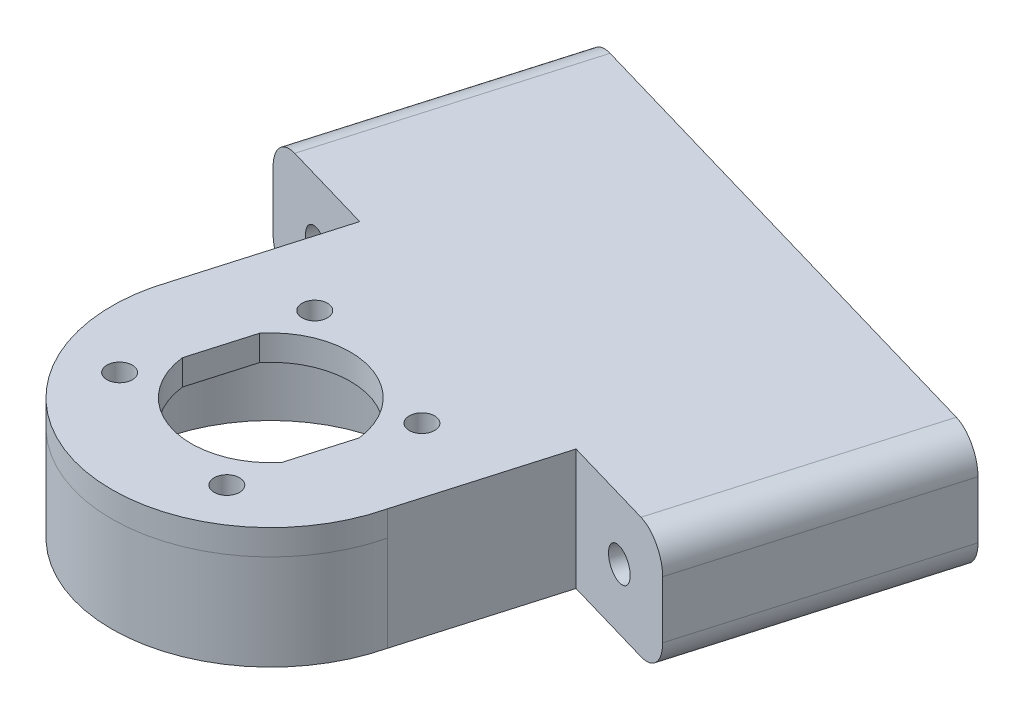
ISO-10303-21;
HEADER;
FILE_DESCRIPTION(('STEP AP214'),'2;1');
FILE_NAME('part.step','',(''),(''),'','','');
FILE_SCHEMA(('AUTOMOTIVE_DESIGN { 1 0 10303 214 1 1 1 1 }'));
ENDSEC;
DATA;
#1=APPLICATION_CONTEXT('core data for automotive mechanical design processes');
#2=APPLICATION_PROTOCOL_DEFINITION('international standard','automotive_design',2000,#1);
#3=PRODUCT_CONTEXT('',#1,'mechanical');
#4=PRODUCT('Part','Part','',(#3));
#5=PRODUCT_RELATED_PRODUCT_CATEGORY('part','',(#4));
#6=PRODUCT_DEFINITION_FORMATION('','',#4);
#7=PRODUCT_DEFINITION_CONTEXT('part definition',#1,'design');
#8=PRODUCT_DEFINITION('design','',#6,#7);
#9=PRODUCT_DEFINITION_SHAPE('','',#8);
#10=(LENGTH_UNIT() NAMED_UNIT(*) SI_UNIT(.MILLI.,.METRE.));
#11=(NAMED_UNIT(*) PLANE_ANGLE_UNIT() SI_UNIT($,.RADIAN.));
#12=(NAMED_UNIT(*) SI_UNIT($,.STERADIAN.) SOLID_ANGLE_UNIT());
#13=UNCERTAINTY_MEASURE_WITH_UNIT(LENGTH_MEASURE(1.E-05),#10,'distance_accuracy_value','');
#14=(GEOMETRIC_REPRESENTATION_CONTEXT(3) GLOBAL_UNCERTAINTY_ASSIGNED_CONTEXT((#13)) GLOBAL_UNIT_ASSIGNED_CONTEXT((#10,
#11,#12)) REPRESENTATION_CONTEXT('',''));
#15=CARTESIAN_POINT('',(0.,0.,0.));
#16=DIRECTION('',(0.,0.,1.));
#17=DIRECTION('',(1.,0.,0.));
#18=AXIS2_PLACEMENT_3D('',#15,#16,#17);
#19=CARTESIAN_POINT('',(0.,0.,0.));
#20=DIRECTION('',(0.,1.,0.));
#21=DIRECTION('',(0.,0.,1.));
#22=AXIS2_PLACEMENT_3D('',#19,#20,#21);
#23=PLANE('',#22);
#24=CARTESIAN_POINT('',(5.88266454172944,0.,48.519689923816));
#25=DIRECTION('',(0.,1.,0.));
#26=DIRECTION('',(0.,0.,1.));
#27=AXIS2_PLACEMENT_3D('',#24,#25,#26);
#28=CIRCLE('',#27,1.99999999999968);
#29=CARTESIAN_POINT('',(5.88266454172944,0.,50.5196899238156));
#30=VERTEX_POINT('',#29);
#31=EDGE_CURVE('E798',#30,#30,#28,.T.);
#32=ORIENTED_EDGE('',*,*,#31,.T.);
#33=EDGE_LOOP('',(#32));
#34=FACE_BOUND('',#33,.T.);
#35=CARTESIAN_POINT('',(12.7949477150797,0.,24.7558446682303));
#36=DIRECTION('',(0.,1.,0.));
#37=DIRECTION('',(0.,0.,1.));
#38=AXIS2_PLACEMENT_3D('',#35,#36,#37);
#39=CIRCLE('',#38,2.00000000000027);
#40=CARTESIAN_POINT('',(12.7949477150797,0.,26.7558446682306));
#41=VERTEX_POINT('',#40);
#42=EDGE_CURVE('E794',#41,#41,#39,.T.);
#43=ORIENTED_EDGE('',*,*,#42,.T.);
#44=EDGE_LOOP('',(#43));
#45=FACE_BOUND('',#44,.T.);
#46=CARTESIAN_POINT('',(36.5587929706653,0.,31.6681278415806));
#47=DIRECTION('',(0.,1.,0.));
#48=DIRECTION('',(0.,0.,1.));
#49=AXIS2_PLACEMENT_3D('',#46,#47,#48);
#50=CIRCLE('',#49,2.);
#51=CARTESIAN_POINT('',(36.5587929706653,0.,33.6681278415806));
#52=VERTEX_POINT('',#51);
#53=EDGE_CURVE('E791',#52,#52,#50,.T.);
#54=ORIENTED_EDGE('',*,*,#53,.T.);
#55=EDGE_LOOP('',(#54));
#56=FACE_BOUND('',#55,.T.);
#57=CARTESIAN_POINT('',(29.6465097973151,0.,55.4319730971662));
#58=DIRECTION('',(0.,1.,0.));
#59=DIRECTION('',(0.,0.,1.));
#60=AXIS2_PLACEMENT_3D('',#57,#58,#59);
#61=CIRCLE('',#60,1.99999999999937);
#62=CARTESIAN_POINT('',(29.6465097973151,0.,57.4319730971655));
#63=VERTEX_POINT('',#62);
#64=EDGE_CURVE('E784',#63,#63,#61,.T.);
#65=ORIENTED_EDGE('',*,*,#64,.T.);
#66=EDGE_LOOP('',(#65));
#67=FACE_BOUND('',#66,.T.);
#68=CARTESIAN_POINT('',(21.2207287561971,0.,40.0939088826978));
#69=DIRECTION('',(0.,1.,0.));
#70=DIRECTION('',(0.,0.,1.));
#71=AXIS2_PLACEMENT_3D('',#68,#69,#70);
#72=CIRCLE('',#71,12.5);
#73=CARTESIAN_POINT('',(8.81010151225684,0.,41.5859984952772));
#74=VERTEX_POINT('',#73);
#75=CARTESIAN_POINT('',(30.8948015652695,0.,48.009862096605));
#76=VERTEX_POINT('',#75);
#77=EDGE_CURVE('E296',#74,#76,#72,.T.);
#78=ORIENTED_EDGE('',*,*,#77,.T.);
#79=DIRECTION('',(0.279298417449034,0.,-0.960204350130984));
#80=VECTOR('',#79,1.);
#81=CARTESIAN_POINT('',(41.3602275698971,0.,12.0306121337904));
#82=LINE('',#81,#80);
#83=CARTESIAN_POINT('',(33.6313560001374,0.,38.6018192701185));
#84=VERTEX_POINT('',#83);
#85=EDGE_CURVE('E778',#76,#84,#82,.T.);
#86=ORIENTED_EDGE('',*,*,#85,.T.);
#87=CARTESIAN_POINT('',(21.2207287561971,0.,40.0939088826978));
#88=DIRECTION('',(0.,1.,0.));
#89=DIRECTION('',(0.,0.,1.));
#90=AXIS2_PLACEMENT_3D('',#87,#88,#89);
#91=CIRCLE('',#90,12.5);
#92=CARTESIAN_POINT('',(11.5466559471248,0.,32.1779556687906));
#93=VERTEX_POINT('',#92);
#94=EDGE_CURVE('E773',#84,#93,#91,.T.);
#95=ORIENTED_EDGE('',*,*,#94,.T.);
#96=DIRECTION('',(0.279298417449035,0.,-0.960204350130984));
#97=VECTOR('',#96,1.);
#98=CARTESIAN_POINT('',(19.2755275168845,0.,5.60674853246267));
#99=LINE('',#98,#97);
#100=EDGE_CURVE('E764',#74,#93,#99,.T.);
#101=ORIENTED_EDGE('',*,*,#100,.F.);
#102=EDGE_LOOP('',(#78,#86,#95,#101));
#103=FACE_BOUND('',#102,.T.);
#104=CARTESIAN_POINT('',(21.2207093880555,0.,40.093908619998));
#105=DIRECTION('',(0.,-1.,0.));
#106=DIRECTION('',(0.,0.,-1.));
#107=AXIS2_PLACEMENT_3D('',#104,#105,#106);
#108=CIRCLE('',#107,22.5);
#109=CARTESIAN_POINT('',(21.2207093880555,0.,17.593908619998));
#110=VERTEX_POINT('',#109);
#111=EDGE_CURVE('E290',#110,#110,#108,.T.);
#112=ORIENTED_EDGE('',*,*,#111,.T.);
#113=EDGE_LOOP('',(#112));
#114=FACE_BOUND('',#113,.T.);
#115=ADVANCED_FACE('F52',(#34,#45,#56,#67,#103,#114),#23,.F.);
#116=CARTESIAN_POINT('',(21.2207287561971,4.,40.0939088826978));
#117=DIRECTION('',(0.,-1.,0.));
#118=DIRECTION('',(0.,0.,-1.));
#119=AXIS2_PLACEMENT_3D('',#116,#117,#118);
#120=CYLINDRICAL_SURFACE('',#119,12.5);
#121=ORIENTED_EDGE('',*,*,#77,.F.);
#122=DIRECTION('',(0.,-1.,0.));
#123=VECTOR('',#122,1.);
#124=CARTESIAN_POINT('',(8.81010151225684,4.,41.5859984952772));
#125=LINE('',#124,#123);
#126=CARTESIAN_POINT('',(8.81010151225684,4.,41.5859984952772));
#127=VERTEX_POINT('',#126);
#128=EDGE_CURVE('E338',#127,#74,#125,.T.);
#129=ORIENTED_EDGE('',*,*,#128,.F.);
#130=CARTESIAN_POINT('',(21.2207287561971,4.,40.0939088826978));
#131=DIRECTION('',(0.,1.,0.));
#132=DIRECTION('',(0.,0.,1.));
#133=AXIS2_PLACEMENT_3D('',#130,#131,#132);
#134=CIRCLE('',#133,12.5);
#135=CARTESIAN_POINT('',(30.8948015652695,4.,48.009862096605));
#136=VERTEX_POINT('',#135);
#137=EDGE_CURVE('E301',#127,#136,#134,.T.);
#138=ORIENTED_EDGE('',*,*,#137,.T.);
#139=DIRECTION('',(0.,-1.,0.));
#140=VECTOR('',#139,1.);
#141=CARTESIAN_POINT('',(30.8948015652695,4.,48.009862096605));
#142=LINE('',#141,#140);
#143=EDGE_CURVE('E802',#136,#76,#142,.T.);
#144=ORIENTED_EDGE('',*,*,#143,.T.);
#145=EDGE_LOOP('',(#121,#129,#138,#144));
#146=FACE_BOUND('',#145,.T.);
#147=ADVANCED_FACE('F324',(#146),#120,.F.);
#148=CARTESIAN_POINT('',(19.2755275168845,4.,5.60674853246267));
#149=DIRECTION('',(-0.960204350130984,0.,-0.279298417449035));
#150=DIRECTION('',(-0.279298417449035,0.,0.960204350130984));
#151=AXIS2_PLACEMENT_3D('',#148,#149,#150);
#152=PLANE('',#151);
#153=ORIENTED_EDGE('',*,*,#100,.T.);
#154=DIRECTION('',(0.,-1.,0.));
#155=VECTOR('',#154,1.);
#156=CARTESIAN_POINT('',(11.5466559471248,4.,32.1779556687906));
#157=LINE('',#156,#155);
#158=CARTESIAN_POINT('',(11.5466559471248,4.,32.1779556687906));
#159=VERTEX_POINT('',#158);
#160=EDGE_CURVE('E767',#159,#93,#157,.T.);
#161=ORIENTED_EDGE('',*,*,#160,.F.);
#162=DIRECTION('',(0.279298417449035,0.,-0.960204350130984));
#163=VECTOR('',#162,1.);
#164=CARTESIAN_POINT('',(19.2755275168845,4.,5.60674853246267));
#165=LINE('',#164,#163);
#166=EDGE_CURVE('E812',#127,#159,#165,.T.);
#167=ORIENTED_EDGE('',*,*,#166,.F.);
#168=ORIENTED_EDGE('',*,*,#128,.T.);
#169=EDGE_LOOP('',(#153,#161,#167,#168));
#170=FACE_BOUND('',#169,.T.);
#171=ADVANCED_FACE('F519',(#170),#152,.F.);
#172=CARTESIAN_POINT('',(21.2207287561971,4.,40.0939088826978));
#173=DIRECTION('',(0.,-1.,0.));
#174=DIRECTION('',(0.,0.,-1.));
#175=AXIS2_PLACEMENT_3D('',#172,#173,#174);
#176=CYLINDRICAL_SURFACE('',#175,12.5);
#177=ORIENTED_EDGE('',*,*,#94,.F.);
#178=DIRECTION('',(0.,-1.,0.));
#179=VECTOR('',#178,1.);
#180=CARTESIAN_POINT('',(33.6313560001374,4.,38.6018192701185));
#181=LINE('',#180,#179);
#182=CARTESIAN_POINT('',(33.6313560001374,4.,38.6018192701185));
#183=VERTEX_POINT('',#182);
#184=EDGE_CURVE('E805',#183,#84,#181,.T.);
#185=ORIENTED_EDGE('',*,*,#184,.F.);
#186=CARTESIAN_POINT('',(21.2207287561971,4.,40.0939088826978));
#187=DIRECTION('',(0.,1.,0.));
#188=DIRECTION('',(0.,0.,1.));
#189=AXIS2_PLACEMENT_3D('',#186,#187,#188);
#190=CIRCLE('',#189,12.5);
#191=EDGE_CURVE('E833',#183,#159,#190,.T.);
#192=ORIENTED_EDGE('',*,*,#191,.T.);
#193=ORIENTED_EDGE('',*,*,#160,.T.);
#194=EDGE_LOOP('',(#177,#185,#192,#193));
#195=FACE_BOUND('',#194,.T.);
#196=ADVANCED_FACE('F515',(#195),#176,.F.);
#197=CARTESIAN_POINT('',(5.88266454172944,4.,48.519689923816));
#198=DIRECTION('',(0.,-1.,0.));
#199=DIRECTION('',(0.,0.,-1.));
#200=AXIS2_PLACEMENT_3D('',#197,#198,#199);
#201=CYLINDRICAL_SURFACE('',#200,1.99999999999968);
#202=CARTESIAN_POINT('',(5.88266454172944,4.,48.519689923816));
#203=DIRECTION('',(0.,1.,0.));
#204=DIRECTION('',(0.,0.,1.));
#205=AXIS2_PLACEMENT_3D('',#202,#203,#204);
#206=CIRCLE('',#205,1.99999999999968);
#207=CARTESIAN_POINT('',(5.88266454172944,4.,50.5196899238156));
#208=VERTEX_POINT('',#207);
#209=EDGE_CURVE('E815',#208,#208,#206,.T.);
#210=ORIENTED_EDGE('',*,*,#209,.T.);
#211=EDGE_LOOP('',(#210));
#212=FACE_BOUND('',#211,.T.);
#213=ORIENTED_EDGE('',*,*,#31,.F.);
#214=EDGE_LOOP('',(#213));
#215=FACE_BOUND('',#214,.T.);
#216=ADVANCED_FACE('F331',(#212,#215),#201,.F.);
#217=CARTESIAN_POINT('',(12.7949477150797,4.,24.7558446682303));
#218=DIRECTION('',(0.,-1.,0.));
#219=DIRECTION('',(0.,0.,-1.));
#220=AXIS2_PLACEMENT_3D('',#217,#218,#219);
#221=CYLINDRICAL_SURFACE('',#220,2.00000000000027);
#222=CARTESIAN_POINT('',(12.7949477150797,4.,24.7558446682303));
#223=DIRECTION('',(0.,1.,0.));
#224=DIRECTION('',(0.,0.,1.));
#225=AXIS2_PLACEMENT_3D('',#222,#223,#224);
#226=CIRCLE('',#225,2.00000000000027);
#227=CARTESIAN_POINT('',(12.7949477150797,4.,26.7558446682306));
#228=VERTEX_POINT('',#227);
#229=EDGE_CURVE('E818',#228,#228,#226,.T.);
#230=ORIENTED_EDGE('',*,*,#229,.T.);
#231=EDGE_LOOP('',(#230));
#232=FACE_BOUND('',#231,.T.);
#233=ORIENTED_EDGE('',*,*,#42,.F.);
#234=EDGE_LOOP('',(#233));
#235=FACE_BOUND('',#234,.T.);
#236=ADVANCED_FACE('F534',(#232,#235),#221,.F.);
#237=CARTESIAN_POINT('',(36.5587929706653,4.,31.6681278415806));
#238=DIRECTION('',(0.,-1.,0.));
#239=DIRECTION('',(0.,0.,-1.));
#240=AXIS2_PLACEMENT_3D('',#237,#238,#239);
#241=CYLINDRICAL_SURFACE('',#240,2.);
#242=CARTESIAN_POINT('',(36.5587929706653,4.,31.6681278415806));
#243=DIRECTION('',(0.,1.,0.));
#244=DIRECTION('',(0.,0.,1.));
#245=AXIS2_PLACEMENT_3D('',#242,#243,#244);
#246=CIRCLE('',#245,2.);
#247=CARTESIAN_POINT('',(36.5587929706653,4.,33.6681278415806));
#248=VERTEX_POINT('',#247);
#249=EDGE_CURVE('E823',#248,#248,#246,.T.);
#250=ORIENTED_EDGE('',*,*,#249,.T.);
#251=EDGE_LOOP('',(#250));
#252=FACE_BOUND('',#251,.T.);
#253=ORIENTED_EDGE('',*,*,#53,.F.);
#254=EDGE_LOOP('',(#253));
#255=FACE_BOUND('',#254,.T.);
#256=ADVANCED_FACE('F529',(#252,#255),#241,.F.);
#257=CARTESIAN_POINT('',(29.6465097973151,4.,55.4319730971662));
#258=DIRECTION('',(0.,-1.,0.));
#259=DIRECTION('',(0.,0.,-1.));
#260=AXIS2_PLACEMENT_3D('',#257,#258,#259);
#261=CYLINDRICAL_SURFACE('',#260,1.99999999999937);
#262=CARTESIAN_POINT('',(29.6465097973151,4.,55.4319730971662));
#263=DIRECTION('',(0.,1.,0.));
#264=DIRECTION('',(0.,0.,1.));
#265=AXIS2_PLACEMENT_3D('',#262,#263,#264);
#266=CIRCLE('',#265,1.99999999999937);
#267=CARTESIAN_POINT('',(29.6465097973151,4.,57.4319730971655));
#268=VERTEX_POINT('',#267);
#269=EDGE_CURVE('E838',#268,#268,#266,.T.);
#270=ORIENTED_EDGE('',*,*,#269,.T.);
#271=EDGE_LOOP('',(#270));
#272=FACE_BOUND('',#271,.T.);
#273=ORIENTED_EDGE('',*,*,#64,.F.);
#274=EDGE_LOOP('',(#273));
#275=FACE_BOUND('',#274,.T.);
#276=ADVANCED_FACE('F533',(#272,#275),#261,.F.);
#277=CARTESIAN_POINT('',(41.3602275698971,4.,12.0306121337904));
#278=DIRECTION('',(-0.960204350130984,0.,-0.279298417449034));
#279=DIRECTION('',(-0.279298417449034,0.,0.960204350130984));
#280=AXIS2_PLACEMENT_3D('',#277,#278,#279);
#281=PLANE('',#280);
#282=ORIENTED_EDGE('',*,*,#85,.F.);
#283=ORIENTED_EDGE('',*,*,#143,.F.);
#284=DIRECTION('',(0.279298417449034,0.,-0.960204350130984));
#285=VECTOR('',#284,1.);
#286=CARTESIAN_POINT('',(41.3602275698971,4.,12.0306121337904));
#287=LINE('',#286,#285);
#288=EDGE_CURVE('E831',#136,#183,#287,.T.);
#289=ORIENTED_EDGE('',*,*,#288,.T.);
#290=ORIENTED_EDGE('',*,*,#184,.T.);
#291=EDGE_LOOP('',(#282,#283,#289,#290));
#292=FACE_BOUND('',#291,.T.);
#293=ADVANCED_FACE('F329',(#292),#281,.T.);
#294=CARTESIAN_POINT('',(21.2207287561971,4.,40.0939088826978));
#295=DIRECTION('',(0.,-1.,0.));
#296=DIRECTION('',(0.,0.,-1.));
#297=AXIS2_PLACEMENT_3D('',#294,#295,#296);
#298=CYLINDRICAL_SURFACE('',#297,25.);
#299=CARTESIAN_POINT('',(21.2207287561971,0.,40.0939088826978));
#300=DIRECTION('',(0.,1.,0.));
#301=DIRECTION('',(-0.94781900744388,0.,-0.318808922598002));
#302=AXIS2_PLACEMENT_3D('',#299,#300,#301);
#303=CIRCLE('',#302,25.);
#304=CARTESIAN_POINT('',(-2.47475516937952,0.,32.1236828781293));
#305=VERTEX_POINT('',#304);
#306=CARTESIAN_POINT('',(45.5043577050817,0.,46.0357009678456));
#307=VERTEX_POINT('',#306);
#308=EDGE_CURVE('E347',#305,#307,#303,.T.);
#309=ORIENTED_EDGE('',*,*,#308,.T.);
#310=DIRECTION('',(0.,-1.,0.));
#311=VECTOR('',#310,1.);
#312=CARTESIAN_POINT('',(45.5044188890737,4.,46.0354906191071));
#313=LINE('',#312,#311);
#314=CARTESIAN_POINT('',(45.5044188890649,4.,46.0354906191431));
#315=VERTEX_POINT('',#314);
#316=EDGE_CURVE('E255',#315,#307,#313,.T.);
#317=ORIENTED_EDGE('',*,*,#316,.F.);
#318=CARTESIAN_POINT('',(21.2207287561971,4.,40.0939088826978));
#319=DIRECTION('',(0.,1.,0.));
#320=DIRECTION('',(0.,0.,1.));
#321=AXIS2_PLACEMENT_3D('',#318,#319,#320);
#322=CIRCLE('',#321,25.);
#323=CARTESIAN_POINT('',(-2.47481737754773,4.,32.1238967482297));
#324=VERTEX_POINT('',#323);
#325=EDGE_CURVE('E806',#324,#315,#322,.T.);
#326=ORIENTED_EDGE('',*,*,#325,.F.);
#327=DIRECTION('',(0.,-1.,0.));
#328=VECTOR('',#327,1.);
#329=CARTESIAN_POINT('',(-2.47481737754771,4.,32.1238967482297));
#330=LINE('',#329,#328);
#331=EDGE_CURVE('E214',#305,#324,#330,.F.);
#332=ORIENTED_EDGE('',*,*,#331,.F.);
#333=EDGE_LOOP('',(#309,#317,#326,#332));
#334=FACE_BOUND('',#333,.T.);
#335=ADVANCED_FACE('F320',(#334),#298,.T.);
#336=CARTESIAN_POINT('',(0.,4.,0.));
#337=DIRECTION('',(0.,1.,0.));
#338=DIRECTION('',(0.,0.,1.));
#339=AXIS2_PLACEMENT_3D('',#336,#337,#338);
#340=PLANE('',#339);
#341=ORIENTED_EDGE('',*,*,#137,.F.);
#342=ORIENTED_EDGE('',*,*,#166,.T.);
#343=ORIENTED_EDGE('',*,*,#191,.F.);
#344=ORIENTED_EDGE('',*,*,#288,.F.);
#345=EDGE_LOOP('',(#341,#342,#343,#344));
#346=FACE_BOUND('',#345,.T.);
#347=ORIENTED_EDGE('',*,*,#269,.F.);
#348=EDGE_LOOP('',(#347));
#349=FACE_BOUND('',#348,.T.);
#350=ORIENTED_EDGE('',*,*,#249,.F.);
#351=EDGE_LOOP('',(#350));
#352=FACE_BOUND('',#351,.T.);
#353=ORIENTED_EDGE('',*,*,#229,.F.);
#354=EDGE_LOOP('',(#353));
#355=FACE_BOUND('',#354,.T.);
#356=ORIENTED_EDGE('',*,*,#209,.F.);
#357=EDGE_LOOP('',(#356));
#358=FACE_BOUND('',#357,.T.);
#359=DIRECTION('',(-0.960204350130984,0.,-0.279298417449035));
#360=VECTOR('',#359,1.);
#361=CARTESIAN_POINT('',(9.05724834699365,4.,-31.1380542089427));
#362=LINE('',#361,#360);
#363=CARTESIAN_POINT('',(77.7610032582543,4.,-11.1539226884972));
#364=VERTEX_POINT('',#363);
#365=CARTESIAN_POINT('',(0.987521140200754,4.,-33.4853275136254));
#366=VERTEX_POINT('',#365);
#367=EDGE_CURVE('E416',#364,#366,#362,.T.);
#368=ORIENTED_EDGE('',*,*,#367,.T.);
#369=DIRECTION('',(-0.279298417449035,0.,0.960204350130983));
#370=VECTOR('',#369,1.);
#371=CARTESIAN_POINT('',(-10.1844155577607,4.,4.92284649161395));
#372=LINE('',#371,#370);
#373=CARTESIAN_POINT('',(-10.1844155577607,4.,4.92284649161394));
#374=VERTEX_POINT('',#373);
#375=EDGE_CURVE('E234',#366,#374,#372,.T.);
#376=ORIENTED_EDGE('',*,*,#375,.T.);
#377=DIRECTION('',(-0.960204350130984,0.,-0.279298417449035));
#378=VECTOR('',#377,1.);
#379=CARTESIAN_POINT('',(-2.11468835096776,4.,7.27011979629667));
#380=LINE('',#379,#378);
#381=CARTESIAN_POINT('',(4.21864969420409,4.,9.11232275334947));
#382=VERTEX_POINT('',#381);
#383=EDGE_CURVE('E225',#382,#374,#380,.T.);
#384=ORIENTED_EDGE('',*,*,#383,.F.);
#385=DIRECTION('',(0.279298417449035,0.,-0.960204350130983));
#386=VECTOR('',#385,1.);
#387=CARTESIAN_POINT('',(-145426.039763837,4.,499986.047547698));
#388=LINE('',#387,#386);
#389=EDGE_CURVE('E207',#324,#382,#388,.T.);
#390=ORIENTED_EDGE('',*,*,#389,.F.);
#391=ORIENTED_EDGE('',*,*,#325,.T.);
#392=DIRECTION('',(0.279298417449035,0.,-0.960204350130983));
#393=VECTOR('',#392,1.);
#394=CARTESIAN_POINT('',(-145378.072412223,4.,500000.));
#395=LINE('',#394,#393);
#396=CARTESIAN_POINT('',(52.1860013083281,4.,23.0647750550066));
#397=VERTEX_POINT('',#396);
#398=EDGE_CURVE('E268',#315,#397,#395,.T.);
#399=ORIENTED_EDGE('',*,*,#398,.T.);
#400=CARTESIAN_POINT('',(66.5890665602929,4.,27.2542513167422));
#401=VERTEX_POINT('',#400);
#402=EDGE_CURVE('E236',#401,#397,#380,.T.);
#403=ORIENTED_EDGE('',*,*,#402,.F.);
#404=DIRECTION('',(-0.279298417449035,0.,0.960204350130983));
#405=VECTOR('',#404,1.);
#406=CARTESIAN_POINT('',(77.7610032582543,4.,-11.1539226884972));
#407=LINE('',#406,#405);
#408=EDGE_CURVE('E365',#401,#364,#407,.F.);
#409=ORIENTED_EDGE('',*,*,#408,.T.);
#410=EDGE_LOOP('',(#368,#376,#384,#390,#391,#399,#403,#409));
#411=FACE_BOUND('',#410,.T.);
#412=ADVANCED_FACE('F232',(#346,#349,#352,#355,#358,#411),#340,.T.);
#413=CARTESIAN_POINT('',(21.2207093880555,-15.,40.093908619998));
#414=DIRECTION('',(0.,-1.,0.));
#415=DIRECTION('',(0.,0.,-1.));
#416=AXIS2_PLACEMENT_3D('',#413,#414,#415);
#417=PLANE('',#416);
#418=DIRECTION('',(-0.960204350130984,0.,-0.279298417449035));
#419=VECTOR('',#418,1.);
#420=CARTESIAN_POINT('',(-2.11468835096776,-15.,7.27011979629667));
#421=LINE('',#420,#419);
#422=CARTESIAN_POINT('',(4.21864969420409,-15.,9.11232275334946));
#423=VERTEX_POINT('',#422);
#424=CARTESIAN_POINT('',(-10.1844155577607,-15.,4.92284649161394));
#425=VERTEX_POINT('',#424);
#426=EDGE_CURVE('E226',#423,#425,#421,.T.);
#427=ORIENTED_EDGE('',*,*,#426,.T.);
#428=DIRECTION('',(-0.279298417449035,0.,0.960204350130983));
#429=VECTOR('',#428,1.);
#430=CARTESIAN_POINT('',(0.987521140200755,-15.,-33.4853275136254));
#431=LINE('',#430,#429);
#432=CARTESIAN_POINT('',(0.987521140200754,-15.,-33.4853275136254));
#433=VERTEX_POINT('',#432);
#434=EDGE_CURVE('E80',#425,#433,#431,.F.);
#435=ORIENTED_EDGE('',*,*,#434,.T.);
#436=DIRECTION('',(-0.960204350130984,0.,-0.279298417449035));
#437=VECTOR('',#436,1.);
#438=CARTESIAN_POINT('',(9.05724834699365,-15.,-31.1380542089427));
#439=LINE('',#438,#437);
#440=CARTESIAN_POINT('',(77.7610032582543,-15.,-11.1539226884972));
#441=VERTEX_POINT('',#440);
#442=EDGE_CURVE('E250',#441,#433,#439,.T.);
#443=ORIENTED_EDGE('',*,*,#442,.F.);
#444=DIRECTION('',(-0.279298417449035,0.,0.960204350130983));
#445=VECTOR('',#444,1.);
#446=CARTESIAN_POINT('',(66.5890665602929,-15.,27.2542513167422));
#447=LINE('',#446,#445);
#448=CARTESIAN_POINT('',(66.5890665602929,-15.,27.2542513167422));
#449=VERTEX_POINT('',#448);
#450=EDGE_CURVE('E350',#441,#449,#447,.T.);
#451=ORIENTED_EDGE('',*,*,#450,.T.);
#452=CARTESIAN_POINT('',(52.1860013083281,-15.,23.0647750550066));
#453=VERTEX_POINT('',#452);
#454=EDGE_CURVE('E244',#449,#453,#421,.T.);
#455=ORIENTED_EDGE('',*,*,#454,.T.);
#456=DIRECTION('',(0.279298417449035,0.,-0.960204350130983));
#457=VECTOR('',#456,1.);
#458=CARTESIAN_POINT('',(-145378.072412223,-15.,500000.));
#459=LINE('',#458,#457);
#460=CARTESIAN_POINT('',(45.5042965192969,-15.,46.0359113160095));
#461=VERTEX_POINT('',#460);
#462=EDGE_CURVE('E264',#461,#453,#459,.T.);
#463=ORIENTED_EDGE('',*,*,#462,.F.);
#464=CARTESIAN_POINT('',(21.2207093880555,-15.,40.093908619998));
#465=DIRECTION('',(0.,-1.,0.));
#466=DIRECTION('',(0.,0.,-1.));
#467=AXIS2_PLACEMENT_3D('',#464,#465,#466);
#468=CIRCLE('',#467,25.);
#469=CARTESIAN_POINT('',(-2.47469295925384,-15.,32.1234690085817));
#470=VERTEX_POINT('',#469);
#471=EDGE_CURVE('E289',#461,#470,#468,.T.);
#472=ORIENTED_EDGE('',*,*,#471,.T.);
#473=DIRECTION('',(0.279298417449035,0.,-0.960204350130983));
#474=VECTOR('',#473,1.);
#475=CARTESIAN_POINT('',(-145426.039763837,-15.,499986.047547698));
#476=LINE('',#475,#474);
#477=EDGE_CURVE('E220',#470,#423,#476,.T.);
#478=ORIENTED_EDGE('',*,*,#477,.T.);
#479=EDGE_LOOP('',(#427,#435,#443,#451,#455,#463,#472,#478));
#480=FACE_BOUND('',#479,.T.);
#481=CARTESIAN_POINT('',(21.2207093880555,-15.,40.093908619998));
#482=DIRECTION('',(0.,-1.,0.));
#483=DIRECTION('',(0.,0.,-1.));
#484=AXIS2_PLACEMENT_3D('',#481,#482,#483);
#485=CIRCLE('',#484,22.5);
#486=CARTESIAN_POINT('',(21.2207093880555,-15.,17.593908619998));
#487=VERTEX_POINT('',#486);
#488=EDGE_CURVE('E285',#487,#487,#485,.T.);
#489=ORIENTED_EDGE('',*,*,#488,.F.);
#490=EDGE_LOOP('',(#489));
#491=FACE_BOUND('',#490,.T.);
#492=ADVANCED_FACE('F315',(#480,#491),#417,.T.);
#493=CARTESIAN_POINT('',(21.2207093880555,-15.,40.093908619998));
#494=DIRECTION('',(0.,1.,0.));
#495=DIRECTION('',(0.,0.,1.));
#496=AXIS2_PLACEMENT_3D('',#493,#494,#495);
#497=CYLINDRICAL_SURFACE('',#496,25.);
#498=ORIENTED_EDGE('',*,*,#471,.F.);
#499=DIRECTION('',(0.,1.,0.));
#500=VECTOR('',#499,1.);
#501=CARTESIAN_POINT('',(45.5042965192969,-15.,46.0359113160095));
#502=LINE('',#501,#500);
#503=EDGE_CURVE('E259',#307,#461,#502,.F.);
#504=ORIENTED_EDGE('',*,*,#503,.F.);
#505=ORIENTED_EDGE('',*,*,#308,.F.);
#506=DIRECTION('',(0.,1.,0.));
#507=VECTOR('',#506,1.);
#508=CARTESIAN_POINT('',(-2.47469295921618,-15.,32.1234690084766));
#509=LINE('',#508,#507);
#510=EDGE_CURVE('E277',#470,#305,#509,.T.);
#511=ORIENTED_EDGE('',*,*,#510,.F.);
#512=EDGE_LOOP('',(#498,#504,#505,#511));
#513=FACE_BOUND('',#512,.T.);
#514=ADVANCED_FACE('F304',(#513),#497,.T.);
#515=CARTESIAN_POINT('',(21.2207093880555,-15.,40.093908619998));
#516=DIRECTION('',(0.,1.,0.));
#517=DIRECTION('',(0.,0.,1.));
#518=AXIS2_PLACEMENT_3D('',#515,#516,#517);
#519=CYLINDRICAL_SURFACE('',#518,22.5);
#520=ORIENTED_EDGE('',*,*,#488,.T.);
#521=EDGE_LOOP('',(#520));
#522=FACE_BOUND('',#521,.T.);
#523=ORIENTED_EDGE('',*,*,#111,.F.);
#524=EDGE_LOOP('',(#523));
#525=FACE_BOUND('',#524,.T.);
#526=ADVANCED_FACE('F314',(#522,#525),#519,.F.);
#527=CARTESIAN_POINT('',(-145426.039763837,-15.,499986.047547698));
#528=DIRECTION('',(-0.960204350130983,0.,-0.279298417449035));
#529=DIRECTION('',(-0.279298417449035,0.,0.960204350130984));
#530=AXIS2_PLACEMENT_3D('',#527,#528,#529);
#531=PLANE('',#530);
#532=ORIENTED_EDGE('',*,*,#510,.T.);
#533=ORIENTED_EDGE('',*,*,#331,.T.);
#534=ORIENTED_EDGE('',*,*,#389,.T.);
#535=DIRECTION('',(0.,1.,0.));
#536=VECTOR('',#535,1.);
#537=CARTESIAN_POINT('',(4.21864969420409,-15.,9.11232275334946));
#538=LINE('',#537,#536);
#539=EDGE_CURVE('E211',#423,#382,#538,.T.);
#540=ORIENTED_EDGE('',*,*,#539,.F.);
#541=ORIENTED_EDGE('',*,*,#477,.F.);
#542=EDGE_LOOP('',(#532,#533,#534,#540,#541));
#543=FACE_BOUND('',#542,.T.);
#544=ADVANCED_FACE('F209',(#543),#531,.T.);
#545=CARTESIAN_POINT('',(-145378.072412223,-15.,500000.));
#546=DIRECTION('',(0.960204350130983,0.,0.279298417449035));
#547=DIRECTION('',(0.279298417449035,0.,-0.960204350130984));
#548=AXIS2_PLACEMENT_3D('',#545,#546,#547);
#549=PLANE('',#548);
#550=ORIENTED_EDGE('',*,*,#398,.F.);
#551=ORIENTED_EDGE('',*,*,#316,.T.);
#552=ORIENTED_EDGE('',*,*,#503,.T.);
#553=ORIENTED_EDGE('',*,*,#462,.T.);
#554=DIRECTION('',(0.,-1.,0.));
#555=VECTOR('',#554,1.);
#556=CARTESIAN_POINT('',(52.1860013083281,-15.,23.0647750550066));
#557=LINE('',#556,#555);
#558=EDGE_CURVE('E228',#397,#453,#557,.T.);
#559=ORIENTED_EDGE('',*,*,#558,.F.);
#560=EDGE_LOOP('',(#550,#551,#552,#553,#559));
#561=FACE_BOUND('',#560,.T.);
#562=ADVANCED_FACE('F465',(#561),#549,.T.);
#563=CARTESIAN_POINT('',(-2.11468835096776,0.,7.27011979629667));
#564=DIRECTION('',(0.279298417449035,0.,-0.960204350130984));
#565=DIRECTION('',(-0.960204350130984,0.,-0.279298417449035));
#566=AXIS2_PLACEMENT_3D('',#563,#564,#565);
#567=PLANE('',#566);
#568=CARTESIAN_POINT('',(61.7880448096379,-5.5,25.857759229497));
#569=DIRECTION('',(0.279298417449035,0.,-0.960204350130984));
#570=DIRECTION('',(-0.960204350130984,0.,-0.279298417449035));
#571=AXIS2_PLACEMENT_3D('',#568,#569,#570);
#572=CIRCLE('',#571,2.5);
#573=CARTESIAN_POINT('',(59.3875339343105,-5.5,25.1595131858744));
#574=VERTEX_POINT('',#573);
#575=EDGE_CURVE('E419',#574,#574,#572,.T.);
#576=ORIENTED_EDGE('',*,*,#575,.T.);
#577=EDGE_LOOP('',(#576));
#578=FACE_BOUND('',#577,.T.);
#579=DIRECTION('',(0.,-1.,0.));
#580=VECTOR('',#579,1.);
#581=CARTESIAN_POINT('',(71.3900883109478,0.,28.6507434039874));
#582=LINE('',#581,#580);
#583=CARTESIAN_POINT('',(71.3900883109478,-1.,28.6507434039874));
#584=VERTEX_POINT('',#583);
#585=CARTESIAN_POINT('',(71.3900883109478,-10.,28.6507434039874));
#586=VERTEX_POINT('',#585);
#587=EDGE_CURVE('E241',#584,#586,#582,.T.);
#588=ORIENTED_EDGE('',*,*,#587,.F.);
#589=CARTESIAN_POINT('',(66.5890665602929,-1.,27.2542513167422));
#590=DIRECTION('',(0.279298417449035,0.,-0.960204350130984));
#591=DIRECTION('',(-0.960204350130984,0.,-0.279298417449035));
#592=AXIS2_PLACEMENT_3D('',#589,#590,#591);
#593=CIRCLE('',#592,5.);
#594=EDGE_CURVE('E13',#584,#401,#593,.F.);
#595=ORIENTED_EDGE('',*,*,#594,.T.);
#596=ORIENTED_EDGE('',*,*,#402,.T.);
#597=ORIENTED_EDGE('',*,*,#558,.T.);
#598=ORIENTED_EDGE('',*,*,#454,.F.);
#599=CARTESIAN_POINT('',(66.5890665602929,-10.,27.2542513167422));
#600=DIRECTION('',(0.279298417449035,0.,-0.960204350130984));
#601=DIRECTION('',(-0.960204350130984,0.,-0.279298417449035));
#602=AXIS2_PLACEMENT_3D('',#599,#600,#601);
#603=CIRCLE('',#602,5.);
#604=EDGE_CURVE('E354',#449,#586,#603,.F.);
#605=ORIENTED_EDGE('',*,*,#604,.T.);
#606=EDGE_LOOP('',(#588,#595,#596,#597,#598,#605));
#607=FACE_BOUND('',#606,.T.);
#608=ADVANCED_FACE('F399',(#578,#607),#567,.F.);
#609=CARTESIAN_POINT('',(-5.38339380710574,-5.5,6.31933857885911));
#610=DIRECTION('',(0.279298417449035,0.,-0.960204350130984));
#611=DIRECTION('',(-0.960204350130984,0.,-0.279298417449035));
#612=AXIS2_PLACEMENT_3D('',#609,#610,#611);
#613=CIRCLE('',#612,2.5);
#614=CARTESIAN_POINT('',(-7.7839046824332,-5.5,5.62109253523653));
#615=VERTEX_POINT('',#614);
#616=EDGE_CURVE('E436',#615,#615,#613,.T.);
#617=ORIENTED_EDGE('',*,*,#616,.T.);
#618=EDGE_LOOP('',(#617));
#619=FACE_BOUND('',#618,.T.);
#620=ORIENTED_EDGE('',*,*,#383,.T.);
#621=CARTESIAN_POINT('',(-10.1844155577607,-1.,4.92284649161394));
#622=DIRECTION('',(0.279298417449035,0.,-0.960204350130984));
#623=DIRECTION('',(-0.960204350130984,0.,-0.279298417449035));
#624=AXIS2_PLACEMENT_3D('',#621,#622,#623);
#625=CIRCLE('',#624,5.);
#626=CARTESIAN_POINT('',(-14.9854373084156,-1.,3.52635440436877));
#627=VERTEX_POINT('',#626);
#628=EDGE_CURVE('E373',#374,#627,#625,.F.);
#629=ORIENTED_EDGE('',*,*,#628,.T.);
#630=DIRECTION('',(0.,1.,0.));
#631=VECTOR('',#630,1.);
#632=CARTESIAN_POINT('',(-14.9854373084156,0.,3.52635440436877));
#633=LINE('',#632,#631);
#634=CARTESIAN_POINT('',(-14.9854373084156,-10.,3.52635440436877));
#635=VERTEX_POINT('',#634);
#636=EDGE_CURVE('E237',#635,#627,#633,.T.);
#637=ORIENTED_EDGE('',*,*,#636,.F.);
#638=CARTESIAN_POINT('',(-10.1844155577607,-10.,4.92284649161395));
#639=DIRECTION('',(0.279298417449035,0.,-0.960204350130984));
#640=DIRECTION('',(-0.960204350130984,0.,-0.279298417449035));
#641=AXIS2_PLACEMENT_3D('',#638,#639,#640);
#642=CIRCLE('',#641,5.);
#643=EDGE_CURVE('E370',#635,#425,#642,.F.);
#644=ORIENTED_EDGE('',*,*,#643,.T.);
#645=ORIENTED_EDGE('',*,*,#426,.F.);
#646=ORIENTED_EDGE('',*,*,#539,.T.);
#647=EDGE_LOOP('',(#620,#629,#637,#644,#645,#646));
#648=FACE_BOUND('',#647,.T.);
#649=ADVANCED_FACE('F224',(#619,#648),#567,.F.);
#650=CARTESIAN_POINT('',(-3.81350061045416,0.,-34.8818196008706));
#651=DIRECTION('',(0.960204350130983,0.,0.279298417449035));
#652=DIRECTION('',(0.279298417449035,0.,-0.960204350130983));
#653=AXIS2_PLACEMENT_3D('',#650,#651,#652);
#654=PLANE('',#653);
#655=ORIENTED_EDGE('',*,*,#636,.T.);
#656=DIRECTION('',(-0.279298417449035,0.,0.960204350130983));
#657=VECTOR('',#656,1.);
#658=CARTESIAN_POINT('',(-3.81350061045416,-1.,-34.8818196008706));
#659=LINE('',#658,#657);
#660=CARTESIAN_POINT('',(-3.81350061045416,-1.,-34.8818196008706));
#661=VERTEX_POINT('',#660);
#662=EDGE_CURVE('E379',#627,#661,#659,.F.);
#663=ORIENTED_EDGE('',*,*,#662,.T.);
#664=DIRECTION('',(0.,1.,0.));
#665=VECTOR('',#664,1.);
#666=CARTESIAN_POINT('',(-3.81350061045416,0.,-34.8818196008706));
#667=LINE('',#666,#665);
#668=CARTESIAN_POINT('',(-3.81350061045416,-10.,-34.8818196008706));
#669=VERTEX_POINT('',#668);
#670=EDGE_CURVE('E413',#669,#661,#667,.T.);
#671=ORIENTED_EDGE('',*,*,#670,.F.);
#672=DIRECTION('',(-0.279298417449035,0.,0.960204350130983));
#673=VECTOR('',#672,1.);
#674=CARTESIAN_POINT('',(-14.9854373084156,-10.,3.52635440436876));
#675=LINE('',#674,#673);
#676=EDGE_CURVE('E375',#669,#635,#675,.T.);
#677=ORIENTED_EDGE('',*,*,#676,.T.);
#678=EDGE_LOOP('',(#655,#663,#671,#677));
#679=FACE_BOUND('',#678,.T.);
#680=ADVANCED_FACE('F460',(#679),#654,.F.);
#681=CARTESIAN_POINT('',(82.5620250089092,0.,-9.75743060125199));
#682=DIRECTION('',(-0.960204350130983,0.,-0.279298417449035));
#683=DIRECTION('',(-0.279298417449035,0.,0.960204350130983));
#684=AXIS2_PLACEMENT_3D('',#681,#682,#683);
#685=PLANE('',#684);
#686=DIRECTION('',(0.,-1.,0.));
#687=VECTOR('',#686,1.);
#688=CARTESIAN_POINT('',(82.5620250089092,0.,-9.75743060125199));
#689=LINE('',#688,#687);
#690=CARTESIAN_POINT('',(82.5620250089092,-1.,-9.75743060125199));
#691=VERTEX_POINT('',#690);
#692=CARTESIAN_POINT('',(82.5620250089092,-10.,-9.75743060125199));
#693=VERTEX_POINT('',#692);
#694=EDGE_CURVE('E260',#691,#693,#689,.T.);
#695=ORIENTED_EDGE('',*,*,#694,.F.);
#696=DIRECTION('',(-0.279298417449035,0.,0.960204350130983));
#697=VECTOR('',#696,1.);
#698=CARTESIAN_POINT('',(71.3900883109478,-1.,28.6507434039873));
#699=LINE('',#698,#697);
#700=EDGE_CURVE('E61',#691,#584,#699,.T.);
#701=ORIENTED_EDGE('',*,*,#700,.T.);
#702=ORIENTED_EDGE('',*,*,#587,.T.);
#703=DIRECTION('',(-0.279298417449035,0.,0.960204350130983));
#704=VECTOR('',#703,1.);
#705=CARTESIAN_POINT('',(82.5620250089092,-10.,-9.75743060125199));
#706=LINE('',#705,#704);
#707=EDGE_CURVE('E358',#586,#693,#706,.F.);
#708=ORIENTED_EDGE('',*,*,#707,.T.);
#709=EDGE_LOOP('',(#695,#701,#702,#708));
#710=FACE_BOUND('',#709,.T.);
#711=ADVANCED_FACE('F396',(#710),#685,.F.);
#712=CARTESIAN_POINT('',(9.05724834699365,0.,-31.1380542089427));
#713=DIRECTION('',(0.279298417449035,0.,-0.960204350130984));
#714=DIRECTION('',(-0.960204350130984,0.,-0.279298417449035));
#715=AXIS2_PLACEMENT_3D('',#712,#713,#714);
#716=PLANE('',#715);
#717=CARTESIAN_POINT('',(5.78854289085568,-5.5,-32.0888354263802));
#718=DIRECTION('',(0.279298417449035,0.,-0.960204350130984));
#719=DIRECTION('',(-0.960204350130984,0.,-0.279298417449035));
#720=AXIS2_PLACEMENT_3D('',#717,#718,#719);
#721=CIRCLE('',#720,2.5);
#722=CARTESIAN_POINT('',(3.38803201552822,-5.5,-32.7870814700028));
#723=VERTEX_POINT('',#722);
#724=EDGE_CURVE('E441',#723,#723,#721,.T.);
#725=ORIENTED_EDGE('',*,*,#724,.F.);
#726=EDGE_LOOP('',(#725));
#727=FACE_BOUND('',#726,.T.);
#728=CARTESIAN_POINT('',(72.9599815075994,-5.5,-12.5504147757424));
#729=DIRECTION('',(0.279298417449035,0.,-0.960204350130984));
#730=DIRECTION('',(-0.960204350130984,0.,-0.279298417449035));
#731=AXIS2_PLACEMENT_3D('',#728,#729,#730);
#732=CIRCLE('',#731,2.5);
#733=CARTESIAN_POINT('',(70.5594706322719,-5.5,-13.2486608193649));
#734=VERTEX_POINT('',#733);
#735=EDGE_CURVE('E431',#734,#734,#732,.T.);
#736=ORIENTED_EDGE('',*,*,#735,.F.);
#737=EDGE_LOOP('',(#736));
#738=FACE_BOUND('',#737,.T.);
#739=ORIENTED_EDGE('',*,*,#670,.T.);
#740=CARTESIAN_POINT('',(0.987521140200755,-1.,-33.4853275136254));
#741=DIRECTION('',(0.279298417449035,0.,-0.960204350130984));
#742=DIRECTION('',(-0.960204350130984,0.,-0.279298417449035));
#743=AXIS2_PLACEMENT_3D('',#740,#741,#742);
#744=CIRCLE('',#743,5.);
#745=EDGE_CURVE('E388',#661,#366,#744,.T.);
#746=ORIENTED_EDGE('',*,*,#745,.T.);
#747=ORIENTED_EDGE('',*,*,#367,.F.);
#748=CARTESIAN_POINT('',(77.7610032582543,-1.,-11.1539226884972));
#749=DIRECTION('',(0.279298417449035,0.,-0.960204350130984));
#750=DIRECTION('',(-0.960204350130984,0.,-0.279298417449035));
#751=AXIS2_PLACEMENT_3D('',#748,#749,#750);
#752=CIRCLE('',#751,5.);
#753=EDGE_CURVE('E382',#364,#691,#752,.T.);
#754=ORIENTED_EDGE('',*,*,#753,.T.);
#755=ORIENTED_EDGE('',*,*,#694,.T.);
#756=CARTESIAN_POINT('',(77.7610032582543,-10.,-11.1539226884972));
#757=DIRECTION('',(0.279298417449035,0.,-0.960204350130984));
#758=DIRECTION('',(-0.960204350130984,0.,-0.279298417449035));
#759=AXIS2_PLACEMENT_3D('',#756,#757,#758);
#760=CIRCLE('',#759,5.);
#761=EDGE_CURVE('E362',#693,#441,#760,.T.);
#762=ORIENTED_EDGE('',*,*,#761,.T.);
#763=ORIENTED_EDGE('',*,*,#442,.T.);
#764=CARTESIAN_POINT('',(0.987521140200754,-10.,-33.4853275136254));
#765=DIRECTION('',(0.279298417449035,0.,-0.960204350130984));
#766=DIRECTION('',(-0.960204350130984,0.,-0.279298417449035));
#767=AXIS2_PLACEMENT_3D('',#764,#765,#766);
#768=CIRCLE('',#767,5.);
#769=EDGE_CURVE('E385',#433,#669,#768,.T.);
#770=ORIENTED_EDGE('',*,*,#769,.T.);
#771=EDGE_LOOP('',(#739,#746,#747,#754,#755,#762,#763,#770));
#772=FACE_BOUND('',#771,.T.);
#773=ADVANCED_FACE('F409',(#727,#738,#772),#716,.T.);
#774=CARTESIAN_POINT('',(45.2632299733995,-5.5,82.6686757960418));
#775=DIRECTION('',(0.279298417449035,0.,-0.960204350130983));
#776=DIRECTION('',(-0.960204350130984,0.,-0.279298417449035));
#777=AXIS2_PLACEMENT_3D('',#774,#775,#776);
#778=CYLINDRICAL_SURFACE('',#777,2.5);
#779=ORIENTED_EDGE('',*,*,#735,.T.);
#780=EDGE_LOOP('',(#779));
#781=FACE_BOUND('',#780,.T.);
#782=ORIENTED_EDGE('',*,*,#575,.F.);
#783=EDGE_LOOP('',(#782));
#784=FACE_BOUND('',#783,.T.);
#785=ADVANCED_FACE('F453',(#781,#784),#778,.F.);
#786=CARTESIAN_POINT('',(-21.9082086433442,-5.5,63.130255145404));
#787=DIRECTION('',(0.279298417449035,0.,-0.960204350130983));
#788=DIRECTION('',(-0.960204350130984,0.,-0.279298417449035));
#789=AXIS2_PLACEMENT_3D('',#786,#787,#788);
#790=CYLINDRICAL_SURFACE('',#789,2.5);
#791=ORIENTED_EDGE('',*,*,#724,.T.);
#792=EDGE_LOOP('',(#791));
#793=FACE_BOUND('',#792,.T.);
#794=ORIENTED_EDGE('',*,*,#616,.F.);
#795=EDGE_LOOP('',(#794));
#796=FACE_BOUND('',#795,.T.);
#797=ADVANCED_FACE('F448',(#793,#796),#790,.F.);
#798=CARTESIAN_POINT('',(59.6066046836564,-10.,51.2593650220266));
#799=DIRECTION('',(0.279298417449035,0.,-0.960204350130983));
#800=DIRECTION('',(-0.960204350130983,0.,-0.279298417449035));
#801=AXIS2_PLACEMENT_3D('',#798,#799,#800);
#802=CYLINDRICAL_SURFACE('',#801,5.);
#803=ORIENTED_EDGE('',*,*,#761,.F.);
#804=ORIENTED_EDGE('',*,*,#707,.F.);
#805=ORIENTED_EDGE('',*,*,#604,.F.);
#806=ORIENTED_EDGE('',*,*,#450,.F.);
#807=EDGE_LOOP('',(#803,#804,#805,#806));
#808=FACE_BOUND('',#807,.T.);
#809=ADVANCED_FACE('F406',(#808),#802,.T.);
#810=CARTESIAN_POINT('',(-8.0697272067929,-1.,-2.34727330468273));
#811=DIRECTION('',(0.279298417449035,0.,-0.960204350130983));
#812=DIRECTION('',(-0.960204350130983,0.,-0.279298417449035));
#813=AXIS2_PLACEMENT_3D('',#810,#811,#812);
#814=CYLINDRICAL_SURFACE('',#813,5.);
#815=ORIENTED_EDGE('',*,*,#745,.F.);
#816=ORIENTED_EDGE('',*,*,#662,.F.);
#817=ORIENTED_EDGE('',*,*,#628,.F.);
#818=ORIENTED_EDGE('',*,*,#375,.F.);
#819=EDGE_LOOP('',(#815,#816,#817,#818));
#820=FACE_BOUND('',#819,.T.);
#821=ADVANCED_FACE('F582',(#820),#814,.T.);
#822=CARTESIAN_POINT('',(0.987521140200754,-10.,-33.4853275136254));
#823=DIRECTION('',(0.279298417449035,0.,-0.960204350130983));
#824=DIRECTION('',(-0.960204350130983,0.,-0.279298417449035));
#825=AXIS2_PLACEMENT_3D('',#822,#823,#824);
#826=CYLINDRICAL_SURFACE('',#825,5.);
#827=ORIENTED_EDGE('',*,*,#769,.F.);
#828=ORIENTED_EDGE('',*,*,#434,.F.);
#829=ORIENTED_EDGE('',*,*,#643,.F.);
#830=ORIENTED_EDGE('',*,*,#676,.F.);
#831=EDGE_LOOP('',(#827,#828,#829,#830));
#832=FACE_BOUND('',#831,.T.);
#833=ADVANCED_FACE('F587',(#832),#826,.T.);
#834=CARTESIAN_POINT('',(77.7610032582543,-1.,-11.1539226884972));
#835=DIRECTION('',(0.279298417449035,0.,-0.960204350130983));
#836=DIRECTION('',(-0.960204350130983,0.,-0.279298417449035));
#837=AXIS2_PLACEMENT_3D('',#834,#835,#836);
#838=CYLINDRICAL_SURFACE('',#837,5.);
#839=ORIENTED_EDGE('',*,*,#753,.F.);
#840=ORIENTED_EDGE('',*,*,#408,.F.);
#841=ORIENTED_EDGE('',*,*,#594,.F.);
#842=ORIENTED_EDGE('',*,*,#700,.F.);
#843=EDGE_LOOP('',(#839,#840,#841,#842));
#844=FACE_BOUND('',#843,.T.);
#845=ADVANCED_FACE('F54',(#844),#838,.T.);
#846=CLOSED_SHELL('',(#115,#147,#171,#196,#216,#236,#256,#276,#293,#335,#412,#492,#514,#526,
#544,#562,#608,#649,#680,#711,#773,#785,#797,#809,#821,#833,#845));
#847=MANIFOLD_SOLID_BREP('B2',#846);
#848=ADVANCED_BREP_SHAPE_REPRESENTATION('',(#18,#847),#14);
#849=SHAPE_DEFINITION_REPRESENTATION(#9,#848);
ENDSEC;
END-ISO-10303-21;
